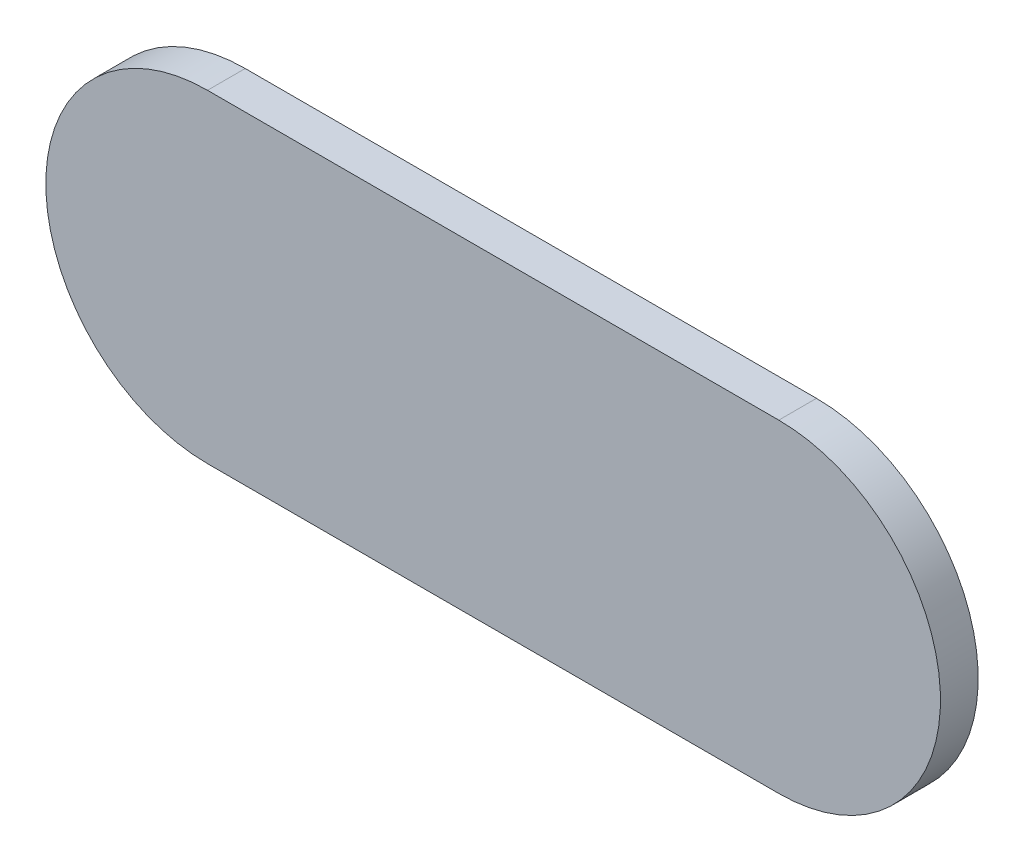
ISO-10303-21;
HEADER;
FILE_DESCRIPTION(('STEP AP214'),'2;1');
FILE_NAME('part.step','',(''),(''),'','','');
FILE_SCHEMA(('AUTOMOTIVE_DESIGN { 1 0 10303 214 1 1 1 1 }'));
ENDSEC;
DATA;
#1=APPLICATION_CONTEXT('core data for automotive mechanical design processes');
#2=APPLICATION_PROTOCOL_DEFINITION('international standard','automotive_design',2000,#1);
#3=PRODUCT_CONTEXT('',#1,'mechanical');
#4=PRODUCT('Part','Part','',(#3));
#5=PRODUCT_RELATED_PRODUCT_CATEGORY('part','',(#4));
#6=PRODUCT_DEFINITION_FORMATION('','',#4);
#7=PRODUCT_DEFINITION_CONTEXT('part definition',#1,'design');
#8=PRODUCT_DEFINITION('design','',#6,#7);
#9=PRODUCT_DEFINITION_SHAPE('','',#8);
#10=(LENGTH_UNIT() NAMED_UNIT(*) SI_UNIT(.MILLI.,.METRE.));
#11=(NAMED_UNIT(*) PLANE_ANGLE_UNIT() SI_UNIT($,.RADIAN.));
#12=(NAMED_UNIT(*) SI_UNIT($,.STERADIAN.) SOLID_ANGLE_UNIT());
#13=UNCERTAINTY_MEASURE_WITH_UNIT(LENGTH_MEASURE(1.E-05),#10,'distance_accuracy_value','');
#14=(GEOMETRIC_REPRESENTATION_CONTEXT(3) GLOBAL_UNCERTAINTY_ASSIGNED_CONTEXT((#13)) GLOBAL_UNIT_ASSIGNED_CONTEXT((#10,
#11,#12)) REPRESENTATION_CONTEXT('',''));
#15=CARTESIAN_POINT('',(0.,0.,0.));
#16=DIRECTION('',(0.,0.,1.));
#17=DIRECTION('',(1.,0.,0.));
#18=AXIS2_PLACEMENT_3D('',#15,#16,#17);
#19=CARTESIAN_POINT('',(128.21,-117.66,1.635));
#20=DIRECTION('',(0.,0.,1.));
#21=DIRECTION('',(1.,0.,0.));
#22=AXIS2_PLACEMENT_3D('',#19,#20,#21);
#23=PLANE('',#22);
#24=DIRECTION('',(-1.,0.,0.));
#25=VECTOR('',#24,1.);
#26=CARTESIAN_POINT('',(128.21,-117.66,1.635));
#27=LINE('',#26,#25);
#28=CARTESIAN_POINT('',(128.21,-117.66,1.635));
#29=VERTEX_POINT('',#28);
#30=CARTESIAN_POINT('',(127.68,-117.66,1.635));
#31=VERTEX_POINT('',#30);
#32=EDGE_CURVE('E83',#29,#31,#27,.T.);
#33=ORIENTED_EDGE('',*,*,#32,.T.);
#34=CARTESIAN_POINT('',(127.68,-117.81,1.635));
#35=DIRECTION('',(0.,0.,1.));
#36=DIRECTION('',(0.,1.,0.));
#37=AXIS2_PLACEMENT_3D('',#34,#35,#36);
#38=CIRCLE('',#37,0.15);
#39=CARTESIAN_POINT('',(127.68,-117.96,1.635));
#40=VERTEX_POINT('',#39);
#41=EDGE_CURVE('E110',#31,#40,#38,.T.);
#42=ORIENTED_EDGE('',*,*,#41,.T.);
#43=DIRECTION('',(1.,0.,0.));
#44=VECTOR('',#43,1.);
#45=CARTESIAN_POINT('',(127.68,-117.96,1.635));
#46=LINE('',#45,#44);
#47=CARTESIAN_POINT('',(128.21,-117.96,1.635));
#48=VERTEX_POINT('',#47);
#49=EDGE_CURVE('E75',#40,#48,#46,.T.);
#50=ORIENTED_EDGE('',*,*,#49,.T.);
#51=CARTESIAN_POINT('',(128.21,-117.81,1.635));
#52=DIRECTION('',(0.,0.,1.));
#53=DIRECTION('',(-1.894780628694E-13,-1.,0.));
#54=AXIS2_PLACEMENT_3D('',#51,#52,#53);
#55=CIRCLE('',#54,0.15);
#56=EDGE_CURVE('E11',#48,#29,#55,.T.);
#57=ORIENTED_EDGE('',*,*,#56,.T.);
#58=EDGE_LOOP('',(#33,#42,#50,#57));
#59=FACE_BOUND('',#58,.T.);
#60=ADVANCED_FACE('F17',(#59),#23,.T.);
#61=CARTESIAN_POINT('',(128.21,-117.66,1.6));
#62=DIRECTION('',(0.,0.,1.));
#63=DIRECTION('',(1.,0.,0.));
#64=AXIS2_PLACEMENT_3D('',#61,#62,#63);
#65=PLANE('',#64);
#66=CARTESIAN_POINT('',(128.21,-117.81,1.6));
#67=DIRECTION('',(0.,0.,1.));
#68=DIRECTION('',(-1.894780628694E-13,-1.,0.));
#69=AXIS2_PLACEMENT_3D('',#66,#67,#68);
#70=CIRCLE('',#69,0.15);
#71=CARTESIAN_POINT('',(128.21,-117.96,1.6));
#72=VERTEX_POINT('',#71);
#73=CARTESIAN_POINT('',(128.21,-117.66,1.6));
#74=VERTEX_POINT('',#73);
#75=EDGE_CURVE('E26',#72,#74,#70,.T.);
#76=ORIENTED_EDGE('',*,*,#75,.F.);
#77=DIRECTION('',(1.,0.,0.));
#78=VECTOR('',#77,1.);
#79=CARTESIAN_POINT('',(127.68,-117.96,1.6));
#80=LINE('',#79,#78);
#81=CARTESIAN_POINT('',(127.68,-117.96,1.6));
#82=VERTEX_POINT('',#81);
#83=EDGE_CURVE('E100',#82,#72,#80,.T.);
#84=ORIENTED_EDGE('',*,*,#83,.F.);
#85=CARTESIAN_POINT('',(127.68,-117.81,1.6));
#86=DIRECTION('',(0.,0.,1.));
#87=DIRECTION('',(0.,1.,0.));
#88=AXIS2_PLACEMENT_3D('',#85,#86,#87);
#89=CIRCLE('',#88,0.15);
#90=CARTESIAN_POINT('',(127.68,-117.66,1.6));
#91=VERTEX_POINT('',#90);
#92=EDGE_CURVE('E85',#91,#82,#89,.T.);
#93=ORIENTED_EDGE('',*,*,#92,.F.);
#94=DIRECTION('',(-1.,0.,0.));
#95=VECTOR('',#94,1.);
#96=CARTESIAN_POINT('',(128.21,-117.66,1.6));
#97=LINE('',#96,#95);
#98=EDGE_CURVE('E81',#74,#91,#97,.T.);
#99=ORIENTED_EDGE('',*,*,#98,.F.);
#100=EDGE_LOOP('',(#76,#84,#93,#99));
#101=FACE_BOUND('',#100,.T.);
#102=ADVANCED_FACE('F19',(#101),#65,.F.);
#103=CARTESIAN_POINT('',(128.21,-117.81,1.6));
#104=DIRECTION('',(0.,0.,-1.));
#105=DIRECTION('',(-1.894780628694E-13,-1.,0.));
#106=AXIS2_PLACEMENT_3D('',#103,#104,#105);
#107=CYLINDRICAL_SURFACE('',#106,0.15);
#108=ORIENTED_EDGE('',*,*,#75,.T.);
#109=DIRECTION('',(0.,0.,1.));
#110=VECTOR('',#109,1.);
#111=CARTESIAN_POINT('',(128.21,-117.66,1.6));
#112=LINE('',#111,#110);
#113=EDGE_CURVE('E69',#74,#29,#112,.T.);
#114=ORIENTED_EDGE('',*,*,#113,.T.);
#115=ORIENTED_EDGE('',*,*,#56,.F.);
#116=DIRECTION('',(0.,0.,1.));
#117=VECTOR('',#116,1.);
#118=CARTESIAN_POINT('',(128.21,-117.96,1.6));
#119=LINE('',#118,#117);
#120=EDGE_CURVE('E72',#72,#48,#119,.T.);
#121=ORIENTED_EDGE('',*,*,#120,.F.);
#122=EDGE_LOOP('',(#108,#114,#115,#121));
#123=FACE_BOUND('',#122,.T.);
#124=ADVANCED_FACE('F68',(#123),#107,.T.);
#125=CARTESIAN_POINT('',(127.68,-117.96,1.6));
#126=DIRECTION('',(0.,1.,0.));
#127=DIRECTION('',(1.,0.,0.));
#128=AXIS2_PLACEMENT_3D('',#125,#126,#127);
#129=PLANE('',#128);
#130=ORIENTED_EDGE('',*,*,#83,.T.);
#131=ORIENTED_EDGE('',*,*,#120,.T.);
#132=ORIENTED_EDGE('',*,*,#49,.F.);
#133=DIRECTION('',(0.,0.,1.));
#134=VECTOR('',#133,1.);
#135=CARTESIAN_POINT('',(127.68,-117.96,1.6));
#136=LINE('',#135,#134);
#137=EDGE_CURVE('E103',#82,#40,#136,.T.);
#138=ORIENTED_EDGE('',*,*,#137,.F.);
#139=EDGE_LOOP('',(#130,#131,#132,#138));
#140=FACE_BOUND('',#139,.T.);
#141=ADVANCED_FACE('F122',(#140),#129,.F.);
#142=CARTESIAN_POINT('',(127.68,-117.81,1.6));
#143=DIRECTION('',(0.,0.,-1.));
#144=DIRECTION('',(0.,1.,0.));
#145=AXIS2_PLACEMENT_3D('',#142,#143,#144);
#146=CYLINDRICAL_SURFACE('',#145,0.15);
#147=ORIENTED_EDGE('',*,*,#92,.T.);
#148=ORIENTED_EDGE('',*,*,#137,.T.);
#149=ORIENTED_EDGE('',*,*,#41,.F.);
#150=DIRECTION('',(0.,0.,1.));
#151=VECTOR('',#150,1.);
#152=CARTESIAN_POINT('',(127.68,-117.66,1.6));
#153=LINE('',#152,#151);
#154=EDGE_CURVE('E90',#91,#31,#153,.T.);
#155=ORIENTED_EDGE('',*,*,#154,.F.);
#156=EDGE_LOOP('',(#147,#148,#149,#155));
#157=FACE_BOUND('',#156,.T.);
#158=ADVANCED_FACE('F120',(#157),#146,.T.);
#159=CARTESIAN_POINT('',(128.21,-117.66,1.6));
#160=DIRECTION('',(0.,-1.,0.));
#161=DIRECTION('',(0.,0.,-1.));
#162=AXIS2_PLACEMENT_3D('',#159,#160,#161);
#163=PLANE('',#162);
#164=ORIENTED_EDGE('',*,*,#98,.T.);
#165=ORIENTED_EDGE('',*,*,#154,.T.);
#166=ORIENTED_EDGE('',*,*,#32,.F.);
#167=ORIENTED_EDGE('',*,*,#113,.F.);
#168=EDGE_LOOP('',(#164,#165,#166,#167));
#169=FACE_BOUND('',#168,.T.);
#170=ADVANCED_FACE('F79',(#169),#163,.F.);
#171=CLOSED_SHELL('',(#60,#102,#124,#141,#158,#170));
#172=MANIFOLD_SOLID_BREP('B1',#171);
#173=ADVANCED_BREP_SHAPE_REPRESENTATION('',(#18,#172),#14);
#174=SHAPE_DEFINITION_REPRESENTATION(#9,#173);
ENDSEC;
END-ISO-10303-21;
